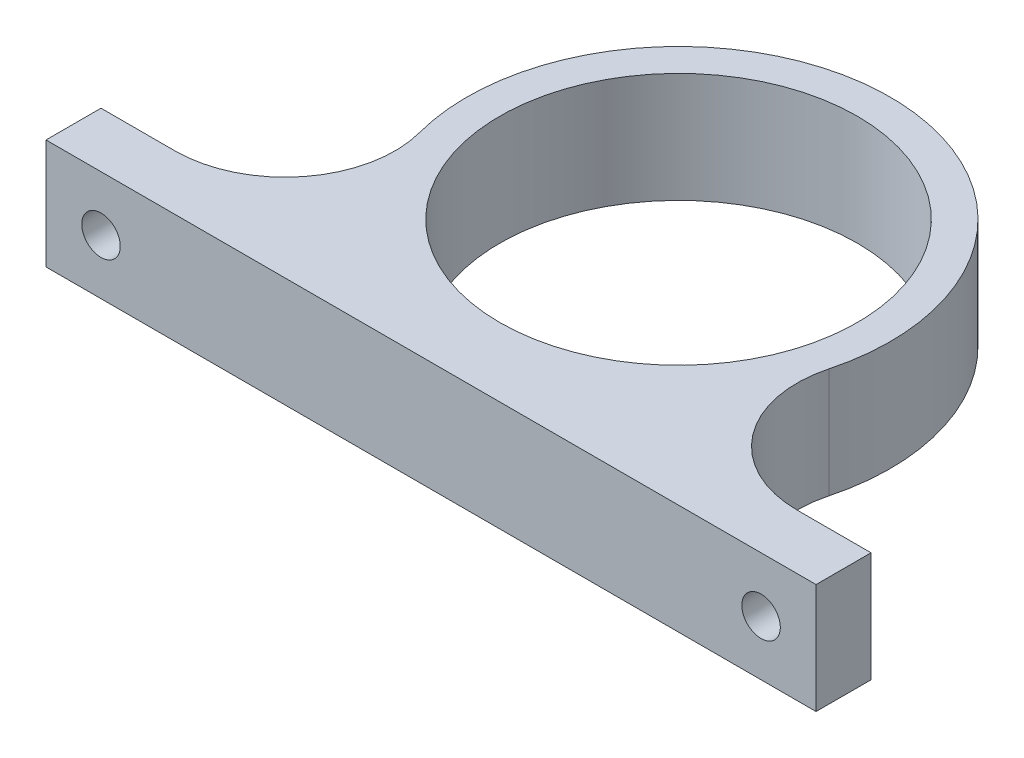
ISO-10303-21;
HEADER;
FILE_DESCRIPTION(('STEP AP214'),'2;1');
FILE_NAME('part.step','',(''),(''),'','','');
FILE_SCHEMA(('AUTOMOTIVE_DESIGN { 1 0 10303 214 1 1 1 1 }'));
ENDSEC;
DATA;
#1=APPLICATION_CONTEXT('core data for automotive mechanical design processes');
#2=APPLICATION_PROTOCOL_DEFINITION('international standard','automotive_design',2000,#1);
#3=PRODUCT_CONTEXT('',#1,'mechanical');
#4=PRODUCT('Part','Part','',(#3));
#5=PRODUCT_RELATED_PRODUCT_CATEGORY('part','',(#4));
#6=PRODUCT_DEFINITION_FORMATION('','',#4);
#7=PRODUCT_DEFINITION_CONTEXT('part definition',#1,'design');
#8=PRODUCT_DEFINITION('design','',#6,#7);
#9=PRODUCT_DEFINITION_SHAPE('','',#8);
#10=(LENGTH_UNIT() NAMED_UNIT(*) SI_UNIT(.MILLI.,.METRE.));
#11=(NAMED_UNIT(*) PLANE_ANGLE_UNIT() SI_UNIT($,.RADIAN.));
#12=(NAMED_UNIT(*) SI_UNIT($,.STERADIAN.) SOLID_ANGLE_UNIT());
#13=UNCERTAINTY_MEASURE_WITH_UNIT(LENGTH_MEASURE(1.E-05),#10,'distance_accuracy_value','');
#14=(GEOMETRIC_REPRESENTATION_CONTEXT(3) GLOBAL_UNCERTAINTY_ASSIGNED_CONTEXT((#13)) GLOBAL_UNIT_ASSIGNED_CONTEXT((#10,
#11,#12)) REPRESENTATION_CONTEXT('',''));
#15=CARTESIAN_POINT('',(0.,0.,0.));
#16=DIRECTION('',(0.,0.,1.));
#17=DIRECTION('',(1.,0.,0.));
#18=AXIS2_PLACEMENT_3D('',#15,#16,#17);
#19=CARTESIAN_POINT('',(0.,10.,0.));
#20=DIRECTION('',(0.,-1.,0.));
#21=DIRECTION('',(0.,0.,-1.));
#22=AXIS2_PLACEMENT_3D('',#19,#20,#21);
#23=CYLINDRICAL_SURFACE('',#22,19.25);
#24=CARTESIAN_POINT('',(0.,10.,0.));
#25=DIRECTION('',(0.,1.,0.));
#26=DIRECTION('',(0.,0.,1.));
#27=AXIS2_PLACEMENT_3D('',#24,#25,#26);
#28=CIRCLE('',#27,19.25);
#29=CARTESIAN_POINT('',(18.6064348143942,10.,4.93589743589743));
#30=VERTEX_POINT('',#29);
#31=CARTESIAN_POINT('',(-18.6064348143942,10.,4.93589743589744));
#32=VERTEX_POINT('',#31);
#33=EDGE_CURVE('E158',#30,#32,#28,.T.);
#34=ORIENTED_EDGE('',*,*,#33,.F.);
#35=DIRECTION('',(0.,-1.,0.));
#36=VECTOR('',#35,1.);
#37=CARTESIAN_POINT('',(18.6064348143942,10.,4.93589743589743));
#38=LINE('',#37,#36);
#39=CARTESIAN_POINT('',(18.6064348143942,0.,4.93589743589743));
#40=VERTEX_POINT('',#39);
#41=EDGE_CURVE('E135',#30,#40,#38,.T.);
#42=ORIENTED_EDGE('',*,*,#41,.T.);
#43=CARTESIAN_POINT('',(0.,0.,0.));
#44=DIRECTION('',(0.,1.,0.));
#45=DIRECTION('',(0.,0.,1.));
#46=AXIS2_PLACEMENT_3D('',#43,#44,#45);
#47=CIRCLE('',#46,19.25);
#48=CARTESIAN_POINT('',(-18.6064348143942,0.,4.93589743589744));
#49=VERTEX_POINT('',#48);
#50=EDGE_CURVE('E152',#40,#49,#47,.T.);
#51=ORIENTED_EDGE('',*,*,#50,.T.);
#52=DIRECTION('',(0.,-1.,0.));
#53=VECTOR('',#52,1.);
#54=CARTESIAN_POINT('',(-18.6064348143942,10.,4.93589743589744));
#55=LINE('',#54,#53);
#56=EDGE_CURVE('E136',#49,#32,#55,.F.);
#57=ORIENTED_EDGE('',*,*,#56,.T.);
#58=EDGE_LOOP('',(#34,#42,#51,#57));
#59=FACE_BOUND('',#58,.T.);
#60=ADVANCED_FACE('F38',(#59),#23,.T.);
#61=CARTESIAN_POINT('',(0.,10.,0.));
#62=DIRECTION('',(0.,1.,0.));
#63=DIRECTION('',(0.,0.,1.));
#64=AXIS2_PLACEMENT_3D('',#61,#62,#63);
#65=PLANE('',#64);
#66=DIRECTION('',(-1.,0.,0.));
#67=VECTOR('',#66,1.);
#68=CARTESIAN_POINT('',(35.,9.99999999999999,17.5));
#69=LINE('',#68,#67);
#70=CARTESIAN_POINT('',(35.,9.99999999999999,17.5));
#71=VERTEX_POINT('',#70);
#72=CARTESIAN_POINT('',(28.2721152374561,9.99999999999999,17.5));
#73=VERTEX_POINT('',#72);
#74=EDGE_CURVE('E187',#71,#73,#69,.T.);
#75=ORIENTED_EDGE('',*,*,#74,.T.);
#76=CARTESIAN_POINT('',(28.2721152374561,10.,7.5));
#77=DIRECTION('',(0.,1.,0.));
#78=DIRECTION('',(0.,0.,1.));
#79=AXIS2_PLACEMENT_3D('',#76,#77,#78);
#80=CIRCLE('',#79,10.);
#81=EDGE_CURVE('E139',#73,#30,#80,.F.);
#82=ORIENTED_EDGE('',*,*,#81,.T.);
#83=ORIENTED_EDGE('',*,*,#33,.T.);
#84=CARTESIAN_POINT('',(-28.2721152374561,10.,7.5));
#85=DIRECTION('',(0.,1.,0.));
#86=DIRECTION('',(0.,0.,1.));
#87=AXIS2_PLACEMENT_3D('',#84,#85,#86);
#88=CIRCLE('',#87,10.);
#89=CARTESIAN_POINT('',(-28.2721152374562,9.99999999999999,17.5));
#90=VERTEX_POINT('',#89);
#91=EDGE_CURVE('E11',#32,#90,#88,.F.);
#92=ORIENTED_EDGE('',*,*,#91,.T.);
#93=CARTESIAN_POINT('',(-35.,9.99999999999999,17.5));
#94=VERTEX_POINT('',#93);
#95=EDGE_CURVE('E190',#90,#94,#69,.T.);
#96=ORIENTED_EDGE('',*,*,#95,.T.);
#97=DIRECTION('',(0.,0.,1.));
#98=VECTOR('',#97,1.);
#99=CARTESIAN_POINT('',(-35.,9.99999999999999,22.5));
#100=LINE('',#99,#98);
#101=CARTESIAN_POINT('',(-35.,9.99999999999999,22.5));
#102=VERTEX_POINT('',#101);
#103=EDGE_CURVE('E189',#94,#102,#100,.T.);
#104=ORIENTED_EDGE('',*,*,#103,.T.);
#105=DIRECTION('',(1.,0.,0.));
#106=VECTOR('',#105,1.);
#107=CARTESIAN_POINT('',(35.,9.99999999999999,22.5));
#108=LINE('',#107,#106);
#109=CARTESIAN_POINT('',(35.,9.99999999999999,22.5));
#110=VERTEX_POINT('',#109);
#111=EDGE_CURVE('E193',#102,#110,#108,.T.);
#112=ORIENTED_EDGE('',*,*,#111,.T.);
#113=DIRECTION('',(0.,0.,-1.));
#114=VECTOR('',#113,1.);
#115=CARTESIAN_POINT('',(35.,9.99999999999999,22.5));
#116=LINE('',#115,#114);
#117=EDGE_CURVE('E172',#110,#71,#116,.T.);
#118=ORIENTED_EDGE('',*,*,#117,.T.);
#119=EDGE_LOOP('',(#75,#82,#83,#92,#96,#104,#112,#118));
#120=FACE_BOUND('',#119,.T.);
#121=CARTESIAN_POINT('',(0.,10.,0.));
#122=DIRECTION('',(0.,1.,0.));
#123=DIRECTION('',(0.,0.,1.));
#124=AXIS2_PLACEMENT_3D('',#121,#122,#123);
#125=CIRCLE('',#124,16.25);
#126=CARTESIAN_POINT('',(0.,10.,16.25));
#127=VERTEX_POINT('',#126);
#128=EDGE_CURVE('E159',#127,#127,#125,.T.);
#129=ORIENTED_EDGE('',*,*,#128,.F.);
#130=EDGE_LOOP('',(#129));
#131=FACE_BOUND('',#130,.T.);
#132=ADVANCED_FACE('F230',(#120,#131),#65,.T.);
#133=CARTESIAN_POINT('',(0.,0.,0.));
#134=DIRECTION('',(0.,1.,0.));
#135=DIRECTION('',(0.,0.,1.));
#136=AXIS2_PLACEMENT_3D('',#133,#134,#135);
#137=PLANE('',#136);
#138=DIRECTION('',(-1.,0.,0.));
#139=VECTOR('',#138,1.);
#140=CARTESIAN_POINT('',(35.,0.,17.5));
#141=LINE('',#140,#139);
#142=CARTESIAN_POINT('',(-28.2721152374562,0.,17.5));
#143=VERTEX_POINT('',#142);
#144=CARTESIAN_POINT('',(-35.,0.,17.5));
#145=VERTEX_POINT('',#144);
#146=EDGE_CURVE('E155',#143,#145,#141,.T.);
#147=ORIENTED_EDGE('',*,*,#146,.F.);
#148=CARTESIAN_POINT('',(-28.2721152374561,0.,7.5));
#149=DIRECTION('',(0.,1.,0.));
#150=DIRECTION('',(0.,0.,1.));
#151=AXIS2_PLACEMENT_3D('',#148,#149,#150);
#152=CIRCLE('',#151,10.);
#153=EDGE_CURVE('E46',#143,#49,#152,.T.);
#154=ORIENTED_EDGE('',*,*,#153,.T.);
#155=ORIENTED_EDGE('',*,*,#50,.F.);
#156=CARTESIAN_POINT('',(28.2721152374561,0.,7.5));
#157=DIRECTION('',(0.,1.,0.));
#158=DIRECTION('',(0.,0.,1.));
#159=AXIS2_PLACEMENT_3D('',#156,#157,#158);
#160=CIRCLE('',#159,10.);
#161=CARTESIAN_POINT('',(28.2721152374561,0.,17.5));
#162=VERTEX_POINT('',#161);
#163=EDGE_CURVE('E140',#40,#162,#160,.T.);
#164=ORIENTED_EDGE('',*,*,#163,.T.);
#165=CARTESIAN_POINT('',(35.,0.,17.5));
#166=VERTEX_POINT('',#165);
#167=EDGE_CURVE('E204',#166,#162,#141,.T.);
#168=ORIENTED_EDGE('',*,*,#167,.F.);
#169=DIRECTION('',(0.,0.,-1.));
#170=VECTOR('',#169,1.);
#171=CARTESIAN_POINT('',(35.,0.,22.5));
#172=LINE('',#171,#170);
#173=CARTESIAN_POINT('',(35.,0.,22.5));
#174=VERTEX_POINT('',#173);
#175=EDGE_CURVE('E181',#174,#166,#172,.T.);
#176=ORIENTED_EDGE('',*,*,#175,.F.);
#177=DIRECTION('',(1.,0.,0.));
#178=VECTOR('',#177,1.);
#179=CARTESIAN_POINT('',(35.,0.,22.5));
#180=LINE('',#179,#178);
#181=CARTESIAN_POINT('',(-35.,0.,22.5));
#182=VERTEX_POINT('',#181);
#183=EDGE_CURVE('E184',#182,#174,#180,.T.);
#184=ORIENTED_EDGE('',*,*,#183,.F.);
#185=DIRECTION('',(0.,0.,1.));
#186=VECTOR('',#185,1.);
#187=CARTESIAN_POINT('',(-35.,0.,22.5));
#188=LINE('',#187,#186);
#189=EDGE_CURVE('E178',#145,#182,#188,.T.);
#190=ORIENTED_EDGE('',*,*,#189,.F.);
#191=EDGE_LOOP('',(#147,#154,#155,#164,#168,#176,#184,#190));
#192=FACE_BOUND('',#191,.T.);
#193=CARTESIAN_POINT('',(0.,0.,0.));
#194=DIRECTION('',(0.,1.,0.));
#195=DIRECTION('',(0.,0.,1.));
#196=AXIS2_PLACEMENT_3D('',#193,#194,#195);
#197=CIRCLE('',#196,16.25);
#198=CARTESIAN_POINT('',(0.,0.,16.25));
#199=VERTEX_POINT('',#198);
#200=EDGE_CURVE('E169',#199,#199,#197,.T.);
#201=ORIENTED_EDGE('',*,*,#200,.T.);
#202=EDGE_LOOP('',(#201));
#203=FACE_BOUND('',#202,.T.);
#204=ADVANCED_FACE('F150',(#192,#203),#137,.F.);
#205=CARTESIAN_POINT('',(0.,10.,0.));
#206=DIRECTION('',(0.,-1.,0.));
#207=DIRECTION('',(0.,0.,-1.));
#208=AXIS2_PLACEMENT_3D('',#205,#206,#207);
#209=CYLINDRICAL_SURFACE('',#208,16.25);
#210=ORIENTED_EDGE('',*,*,#128,.T.);
#211=EDGE_LOOP('',(#210));
#212=FACE_BOUND('',#211,.T.);
#213=ORIENTED_EDGE('',*,*,#200,.F.);
#214=EDGE_LOOP('',(#213));
#215=FACE_BOUND('',#214,.T.);
#216=ADVANCED_FACE('F271',(#212,#215),#209,.F.);
#217=CARTESIAN_POINT('',(35.,80.178344238091,17.5));
#218=DIRECTION('',(0.,0.,1.));
#219=DIRECTION('',(1.,0.,0.));
#220=AXIS2_PLACEMENT_3D('',#217,#218,#219);
#221=PLANE('',#220);
#222=DIRECTION('',(0.,1.,0.));
#223=VECTOR('',#222,1.);
#224=CARTESIAN_POINT('',(-28.2721152374561,0.,17.5));
#225=LINE('',#224,#223);
#226=CARTESIAN_POINT('',(-28.2721152374561,5.27733417995042,17.5));
#227=VERTEX_POINT('',#226);
#228=EDGE_CURVE('E119',#90,#227,#225,.F.);
#229=ORIENTED_EDGE('',*,*,#228,.T.);
#230=CARTESIAN_POINT('',(-30.,5.,17.5));
#231=DIRECTION('',(0.,0.,-1.));
#232=DIRECTION('',(-1.,0.,0.));
#233=AXIS2_PLACEMENT_3D('',#230,#231,#232);
#234=CIRCLE('',#233,1.75000000000001);
#235=CARTESIAN_POINT('',(-28.2721152374561,4.72266582004958,17.5));
#236=VERTEX_POINT('',#235);
#237=EDGE_CURVE('E125',#236,#227,#234,.T.);
#238=ORIENTED_EDGE('',*,*,#237,.F.);
#239=EDGE_CURVE('E120',#236,#143,#225,.F.);
#240=ORIENTED_EDGE('',*,*,#239,.T.);
#241=ORIENTED_EDGE('',*,*,#146,.T.);
#242=DIRECTION('',(0.,-1.,0.));
#243=VECTOR('',#242,1.);
#244=CARTESIAN_POINT('',(-35.,80.178344238091,17.5));
#245=LINE('',#244,#243);
#246=EDGE_CURVE('E175',#94,#145,#245,.T.);
#247=ORIENTED_EDGE('',*,*,#246,.F.);
#248=ORIENTED_EDGE('',*,*,#95,.F.);
#249=EDGE_LOOP('',(#229,#238,#240,#241,#247,#248));
#250=FACE_BOUND('',#249,.T.);
#251=ADVANCED_FACE('F129',(#250),#221,.F.);
#252=DIRECTION('',(0.,1.,0.));
#253=VECTOR('',#252,1.);
#254=CARTESIAN_POINT('',(28.2721152374561,10.,17.5));
#255=LINE('',#254,#253);
#256=CARTESIAN_POINT('',(28.2721152374561,4.72266582004958,17.5));
#257=VERTEX_POINT('',#256);
#258=EDGE_CURVE('E161',#162,#257,#255,.T.);
#259=ORIENTED_EDGE('',*,*,#258,.T.);
#260=CARTESIAN_POINT('',(30.,5.,17.5));
#261=DIRECTION('',(0.,0.,-1.));
#262=DIRECTION('',(-1.,0.,0.));
#263=AXIS2_PLACEMENT_3D('',#260,#261,#262);
#264=CIRCLE('',#263,1.75);
#265=CARTESIAN_POINT('',(28.2721152374561,5.27733417995042,17.5));
#266=VERTEX_POINT('',#265);
#267=EDGE_CURVE('E52',#266,#257,#264,.T.);
#268=ORIENTED_EDGE('',*,*,#267,.F.);
#269=EDGE_CURVE('E166',#266,#73,#255,.T.);
#270=ORIENTED_EDGE('',*,*,#269,.T.);
#271=ORIENTED_EDGE('',*,*,#74,.F.);
#272=DIRECTION('',(0.,-1.,0.));
#273=VECTOR('',#272,1.);
#274=CARTESIAN_POINT('',(35.,80.178344238091,17.5));
#275=LINE('',#274,#273);
#276=EDGE_CURVE('E179',#71,#166,#275,.T.);
#277=ORIENTED_EDGE('',*,*,#276,.T.);
#278=ORIENTED_EDGE('',*,*,#167,.T.);
#279=EDGE_LOOP('',(#259,#268,#270,#271,#277,#278));
#280=FACE_BOUND('',#279,.T.);
#281=ADVANCED_FACE('F252',(#280),#221,.F.);
#282=CARTESIAN_POINT('',(-35.,80.178344238091,22.5));
#283=DIRECTION('',(1.,0.,0.));
#284=DIRECTION('',(0.,0.,-1.));
#285=AXIS2_PLACEMENT_3D('',#282,#283,#284);
#286=PLANE('',#285);
#287=ORIENTED_EDGE('',*,*,#103,.F.);
#288=ORIENTED_EDGE('',*,*,#246,.T.);
#289=ORIENTED_EDGE('',*,*,#189,.T.);
#290=DIRECTION('',(0.,-1.,0.));
#291=VECTOR('',#290,1.);
#292=CARTESIAN_POINT('',(-35.,80.178344238091,22.5));
#293=LINE('',#292,#291);
#294=EDGE_CURVE('E185',#102,#182,#293,.T.);
#295=ORIENTED_EDGE('',*,*,#294,.F.);
#296=EDGE_LOOP('',(#287,#288,#289,#295));
#297=FACE_BOUND('',#296,.T.);
#298=ADVANCED_FACE('F260',(#297),#286,.F.);
#299=CARTESIAN_POINT('',(35.,80.178344238091,22.5));
#300=DIRECTION('',(0.,0.,-1.));
#301=DIRECTION('',(-1.,0.,0.));
#302=AXIS2_PLACEMENT_3D('',#299,#300,#301);
#303=PLANE('',#302);
#304=CARTESIAN_POINT('',(-30.,5.,22.5));
#305=DIRECTION('',(0.,0.,-1.));
#306=DIRECTION('',(-1.,0.,0.));
#307=AXIS2_PLACEMENT_3D('',#304,#305,#306);
#308=CIRCLE('',#307,1.75000000000001);
#309=CARTESIAN_POINT('',(-31.75,5.,22.5));
#310=VERTEX_POINT('',#309);
#311=EDGE_CURVE('E126',#310,#310,#308,.T.);
#312=ORIENTED_EDGE('',*,*,#311,.T.);
#313=EDGE_LOOP('',(#312));
#314=FACE_BOUND('',#313,.T.);
#315=CARTESIAN_POINT('',(30.,5.,22.5));
#316=DIRECTION('',(0.,0.,-1.));
#317=DIRECTION('',(-1.,0.,0.));
#318=AXIS2_PLACEMENT_3D('',#315,#316,#317);
#319=CIRCLE('',#318,1.75);
#320=CARTESIAN_POINT('',(28.25,5.,22.5));
#321=VERTEX_POINT('',#320);
#322=EDGE_CURVE('E207',#321,#321,#319,.T.);
#323=ORIENTED_EDGE('',*,*,#322,.T.);
#324=EDGE_LOOP('',(#323));
#325=FACE_BOUND('',#324,.T.);
#326=ORIENTED_EDGE('',*,*,#111,.F.);
#327=ORIENTED_EDGE('',*,*,#294,.T.);
#328=ORIENTED_EDGE('',*,*,#183,.T.);
#329=DIRECTION('',(0.,-1.,0.));
#330=VECTOR('',#329,1.);
#331=CARTESIAN_POINT('',(35.,80.178344238091,22.5));
#332=LINE('',#331,#330);
#333=EDGE_CURVE('E182',#110,#174,#332,.T.);
#334=ORIENTED_EDGE('',*,*,#333,.F.);
#335=EDGE_LOOP('',(#326,#327,#328,#334));
#336=FACE_BOUND('',#335,.T.);
#337=ADVANCED_FACE('F215',(#314,#325,#336),#303,.F.);
#338=CARTESIAN_POINT('',(35.,80.178344238091,22.5));
#339=DIRECTION('',(-1.,0.,0.));
#340=DIRECTION('',(0.,0.,1.));
#341=AXIS2_PLACEMENT_3D('',#338,#339,#340);
#342=PLANE('',#341);
#343=ORIENTED_EDGE('',*,*,#117,.F.);
#344=ORIENTED_EDGE('',*,*,#333,.T.);
#345=ORIENTED_EDGE('',*,*,#175,.T.);
#346=ORIENTED_EDGE('',*,*,#276,.F.);
#347=EDGE_LOOP('',(#343,#344,#345,#346));
#348=FACE_BOUND('',#347,.T.);
#349=ADVANCED_FACE('F239',(#348),#342,.F.);
#350=CARTESIAN_POINT('',(28.2721152374561,10.,7.5));
#351=DIRECTION('',(0.,-1.,0.));
#352=DIRECTION('',(0.,0.,-1.));
#353=AXIS2_PLACEMENT_3D('',#350,#351,#352);
#354=CYLINDRICAL_SURFACE('',#353,10.);
#355=ORIENTED_EDGE('',*,*,#163,.F.);
#356=ORIENTED_EDGE('',*,*,#41,.F.);
#357=ORIENTED_EDGE('',*,*,#81,.F.);
#358=ORIENTED_EDGE('',*,*,#269,.F.);
#359=EDGE_CURVE('E164',#257,#266,#255,.T.);
#360=ORIENTED_EDGE('',*,*,#359,.F.);
#361=ORIENTED_EDGE('',*,*,#258,.F.);
#362=EDGE_LOOP('',(#355,#356,#357,#358,#360,#361));
#363=FACE_BOUND('',#362,.T.);
#364=ADVANCED_FACE('F237',(#363),#354,.F.);
#365=CARTESIAN_POINT('',(-28.2721152374561,10.,7.5));
#366=DIRECTION('',(0.,-1.,0.));
#367=DIRECTION('',(0.,0.,-1.));
#368=AXIS2_PLACEMENT_3D('',#365,#366,#367);
#369=CYLINDRICAL_SURFACE('',#368,10.);
#370=ORIENTED_EDGE('',*,*,#91,.F.);
#371=ORIENTED_EDGE('',*,*,#56,.F.);
#372=ORIENTED_EDGE('',*,*,#153,.F.);
#373=ORIENTED_EDGE('',*,*,#239,.F.);
#374=EDGE_CURVE('E113',#227,#236,#225,.F.);
#375=ORIENTED_EDGE('',*,*,#374,.F.);
#376=ORIENTED_EDGE('',*,*,#228,.F.);
#377=EDGE_LOOP('',(#370,#371,#372,#373,#375,#376));
#378=FACE_BOUND('',#377,.T.);
#379=ADVANCED_FACE('F40',(#378),#369,.F.);
#380=CARTESIAN_POINT('',(-30.,5.,17.5));
#381=DIRECTION('',(0.,0.,-1.));
#382=DIRECTION('',(-1.,0.,0.));
#383=AXIS2_PLACEMENT_3D('',#380,#381,#382);
#384=PLANE('',#383);
#385=EDGE_CURVE('E59',#227,#236,#234,.T.);
#386=ORIENTED_EDGE('',*,*,#385,.F.);
#387=ORIENTED_EDGE('',*,*,#374,.T.);
#388=EDGE_LOOP('',(#386,#387));
#389=FACE_BOUND('',#388,.T.);
#390=ADVANCED_FACE('F114',(#389),#384,.F.);
#391=CARTESIAN_POINT('',(-30.,5.,22.5));
#392=DIRECTION('',(0.,0.,-1.));
#393=DIRECTION('',(-1.,0.,0.));
#394=AXIS2_PLACEMENT_3D('',#391,#392,#393);
#395=CYLINDRICAL_SURFACE('',#394,1.75000000000001);
#396=ORIENTED_EDGE('',*,*,#311,.F.);
#397=EDGE_LOOP('',(#396));
#398=FACE_BOUND('',#397,.T.);
#399=ORIENTED_EDGE('',*,*,#385,.T.);
#400=ORIENTED_EDGE('',*,*,#237,.T.);
#401=EDGE_LOOP('',(#399,#400));
#402=FACE_BOUND('',#401,.T.);
#403=ADVANCED_FACE('F124',(#398,#402),#395,.F.);
#404=CARTESIAN_POINT('',(30.,5.,22.5));
#405=DIRECTION('',(0.,0.,-1.));
#406=DIRECTION('',(-1.,0.,0.));
#407=AXIS2_PLACEMENT_3D('',#404,#405,#406);
#408=CYLINDRICAL_SURFACE('',#407,1.75);
#409=ORIENTED_EDGE('',*,*,#322,.F.);
#410=EDGE_LOOP('',(#409));
#411=FACE_BOUND('',#410,.T.);
#412=ORIENTED_EDGE('',*,*,#267,.T.);
#413=EDGE_CURVE('E210',#257,#266,#264,.T.);
#414=ORIENTED_EDGE('',*,*,#413,.T.);
#415=EDGE_LOOP('',(#412,#414));
#416=FACE_BOUND('',#415,.T.);
#417=ADVANCED_FACE('F219',(#411,#416),#408,.F.);
#418=CARTESIAN_POINT('',(30.,5.,17.5));
#419=DIRECTION('',(0.,0.,-1.));
#420=DIRECTION('',(-1.,0.,0.));
#421=AXIS2_PLACEMENT_3D('',#418,#419,#420);
#422=PLANE('',#421);
#423=ORIENTED_EDGE('',*,*,#359,.T.);
#424=ORIENTED_EDGE('',*,*,#413,.F.);
#425=EDGE_LOOP('',(#423,#424));
#426=FACE_BOUND('',#425,.T.);
#427=ADVANCED_FACE('F225',(#426),#422,.F.);
#428=CLOSED_SHELL('',(#60,#132,#204,#216,#251,#281,#298,#337,#349,#364,#379,#390,#403,#417,#427));
#429=MANIFOLD_SOLID_BREP('B2',#428);
#430=ADVANCED_BREP_SHAPE_REPRESENTATION('',(#18,#429),#14);
#431=SHAPE_DEFINITION_REPRESENTATION(#9,#430);
ENDSEC;
END-ISO-10303-21;
